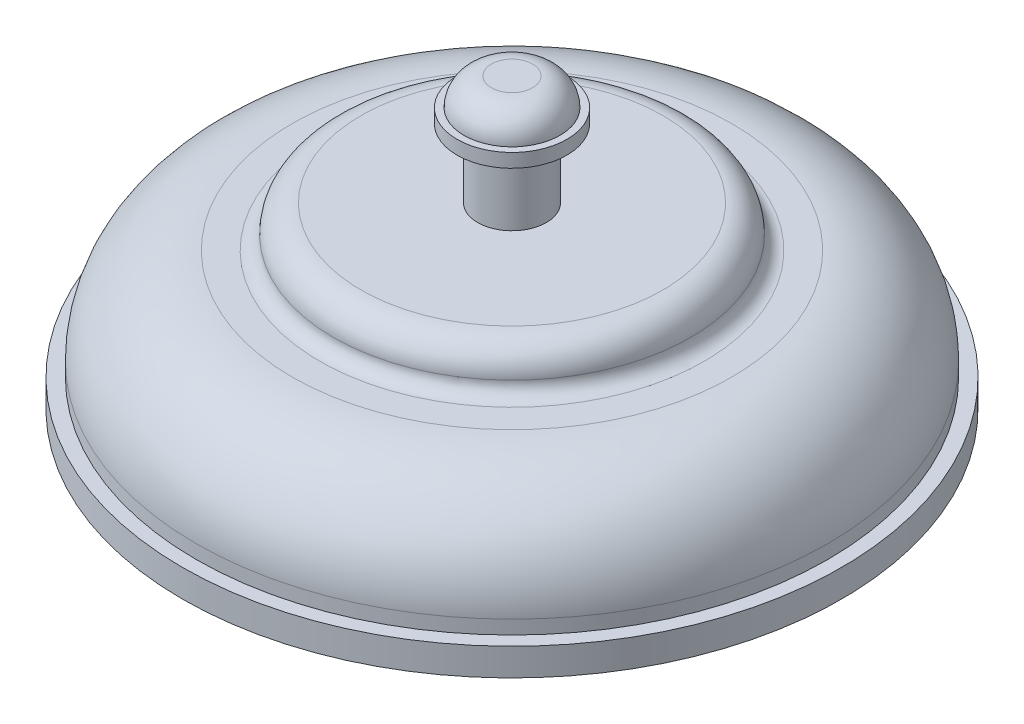
ISO-10303-21;
HEADER;
FILE_DESCRIPTION(('STEP AP214'),'2;1');
FILE_NAME('part.step','',(''),(''),'','','');
FILE_SCHEMA(('AUTOMOTIVE_DESIGN { 1 0 10303 214 1 1 1 1 }'));
ENDSEC;
DATA;
#1=APPLICATION_CONTEXT('core data for automotive mechanical design processes');
#2=APPLICATION_PROTOCOL_DEFINITION('international standard','automotive_design',2000,#1);
#3=PRODUCT_CONTEXT('',#1,'mechanical');
#4=PRODUCT('Part','Part','',(#3));
#5=PRODUCT_RELATED_PRODUCT_CATEGORY('part','',(#4));
#6=PRODUCT_DEFINITION_FORMATION('','',#4);
#7=PRODUCT_DEFINITION_CONTEXT('part definition',#1,'design');
#8=PRODUCT_DEFINITION('design','',#6,#7);
#9=PRODUCT_DEFINITION_SHAPE('','',#8);
#10=(LENGTH_UNIT() NAMED_UNIT(*) SI_UNIT(.MILLI.,.METRE.));
#11=(NAMED_UNIT(*) PLANE_ANGLE_UNIT() SI_UNIT($,.RADIAN.));
#12=(NAMED_UNIT(*) SI_UNIT($,.STERADIAN.) SOLID_ANGLE_UNIT());
#13=UNCERTAINTY_MEASURE_WITH_UNIT(LENGTH_MEASURE(1.E-05),#10,'distance_accuracy_value','');
#14=(GEOMETRIC_REPRESENTATION_CONTEXT(3) GLOBAL_UNCERTAINTY_ASSIGNED_CONTEXT((#13)) GLOBAL_UNIT_ASSIGNED_CONTEXT((#10,
#11,#12)) REPRESENTATION_CONTEXT('',''));
#15=CARTESIAN_POINT('',(0.,0.,0.));
#16=DIRECTION('',(0.,0.,1.));
#17=DIRECTION('',(1.,0.,0.));
#18=AXIS2_PLACEMENT_3D('',#15,#16,#17);
#19=CARTESIAN_POINT('',(0.,6.,0.));
#20=DIRECTION('',(0.,1.,0.));
#21=DIRECTION('',(0.,0.,1.));
#22=AXIS2_PLACEMENT_3D('',#19,#20,#21);
#23=PLANE('',#22);
#24=CARTESIAN_POINT('',(0.,6.,0.));
#25=DIRECTION('',(0.,1.,0.));
#26=DIRECTION('',(0.,0.,1.));
#27=AXIS2_PLACEMENT_3D('',#24,#25,#26);
#28=CIRCLE('',#27,4.);
#29=CARTESIAN_POINT('',(0.,6.,4.));
#30=VERTEX_POINT('',#29);
#31=EDGE_CURVE('P0_E31',#30,#30,#28,.T.);
#32=ORIENTED_EDGE('',*,*,#31,.T.);
#33=EDGE_LOOP('',(#32));
#34=FACE_BOUND('',#33,.T.);
#35=CARTESIAN_POINT('',(0.,6.,0.));
#36=DIRECTION('',(0.,1.,0.));
#37=DIRECTION('',(0.,0.,1.));
#38=AXIS2_PLACEMENT_3D('',#35,#36,#37);
#39=CIRCLE('',#38,3.5);
#40=CARTESIAN_POINT('',(0.,6.,3.5));
#41=VERTEX_POINT('',#40);
#42=EDGE_CURVE('P0_E36',#41,#41,#39,.T.);
#43=ORIENTED_EDGE('',*,*,#42,.F.);
#44=EDGE_LOOP('',(#43));
#45=FACE_BOUND('',#44,.T.);
#46=ADVANCED_FACE('P0_F15',(#34,#45),#23,.T.);
#47=CARTESIAN_POINT('',(0.,5.,0.));
#48=DIRECTION('',(0.,-1.,0.));
#49=DIRECTION('',(0.,0.,-1.));
#50=AXIS2_PLACEMENT_3D('',#47,#48,#49);
#51=CYLINDRICAL_SURFACE('',#50,2.5);
#52=CARTESIAN_POINT('',(0.,5.,0.));
#53=DIRECTION('',(0.,1.,0.));
#54=DIRECTION('',(0.,0.,1.));
#55=AXIS2_PLACEMENT_3D('',#52,#53,#54);
#56=CIRCLE('',#55,2.5);
#57=CARTESIAN_POINT('',(0.,5.,2.5));
#58=VERTEX_POINT('',#57);
#59=EDGE_CURVE('P0_E22',#58,#58,#56,.T.);
#60=ORIENTED_EDGE('',*,*,#59,.F.);
#61=EDGE_LOOP('',(#60));
#62=FACE_BOUND('',#61,.T.);
#63=CARTESIAN_POINT('',(0.,0.,0.));
#64=DIRECTION('',(0.,1.,0.));
#65=DIRECTION('',(0.,0.,1.));
#66=AXIS2_PLACEMENT_3D('',#63,#64,#65);
#67=CIRCLE('',#66,2.5);
#68=CARTESIAN_POINT('',(0.,0.,2.5));
#69=VERTEX_POINT('',#68);
#70=EDGE_CURVE('P0_E26',#69,#69,#67,.T.);
#71=ORIENTED_EDGE('',*,*,#70,.T.);
#72=EDGE_LOOP('',(#71));
#73=FACE_BOUND('',#72,.T.);
#74=ADVANCED_FACE('P0_F45',(#62,#73),#51,.T.);
#75=CARTESIAN_POINT('',(0.,0.,0.));
#76=DIRECTION('',(0.,1.,0.));
#77=DIRECTION('',(0.,0.,1.));
#78=AXIS2_PLACEMENT_3D('',#75,#76,#77);
#79=PLANE('',#78);
#80=ORIENTED_EDGE('',*,*,#70,.F.);
#81=EDGE_LOOP('',(#80));
#82=FACE_BOUND('',#81,.T.);
#83=ADVANCED_FACE('P0_F53',(#82),#79,.F.);
#84=CARTESIAN_POINT('',(0.,5.,0.));
#85=DIRECTION('',(0.,1.,0.));
#86=DIRECTION('',(0.,0.,1.));
#87=AXIS2_PLACEMENT_3D('',#84,#85,#86);
#88=PLANE('',#87);
#89=CARTESIAN_POINT('',(0.,5.,0.));
#90=DIRECTION('',(0.,1.,0.));
#91=DIRECTION('',(0.,0.,1.));
#92=AXIS2_PLACEMENT_3D('',#89,#90,#91);
#93=CIRCLE('',#92,4.);
#94=CARTESIAN_POINT('',(0.,5.,4.));
#95=VERTEX_POINT('',#94);
#96=EDGE_CURVE('P0_E33',#95,#95,#93,.T.);
#97=ORIENTED_EDGE('',*,*,#96,.F.);
#98=EDGE_LOOP('',(#97));
#99=FACE_BOUND('',#98,.T.);
#100=ORIENTED_EDGE('',*,*,#59,.T.);
#101=EDGE_LOOP('',(#100));
#102=FACE_BOUND('',#101,.T.);
#103=ADVANCED_FACE('P0_F58',(#99,#102),#88,.F.);
#104=CARTESIAN_POINT('',(0.,6.,0.));
#105=DIRECTION('',(0.,-1.,0.));
#106=DIRECTION('',(0.,0.,-1.));
#107=AXIS2_PLACEMENT_3D('',#104,#105,#106);
#108=CYLINDRICAL_SURFACE('',#107,4.);
#109=ORIENTED_EDGE('',*,*,#31,.F.);
#110=EDGE_LOOP('',(#109));
#111=FACE_BOUND('',#110,.T.);
#112=ORIENTED_EDGE('',*,*,#96,.T.);
#113=EDGE_LOOP('',(#112));
#114=FACE_BOUND('',#113,.T.);
#115=ADVANCED_FACE('P0_F61',(#111,#114),#108,.T.);
#116=CARTESIAN_POINT('',(0.,8.,0.));
#117=DIRECTION('',(0.,1.,0.));
#118=DIRECTION('',(0.,0.,1.));
#119=AXIS2_PLACEMENT_3D('',#116,#117,#118);
#120=PLANE('',#119);
#121=CARTESIAN_POINT('',(0.,8.,0.));
#122=DIRECTION('',(0.,1.,0.));
#123=DIRECTION('',(0.,0.,1.));
#124=AXIS2_PLACEMENT_3D('',#121,#122,#123);
#125=CIRCLE('',#124,1.5);
#126=CARTESIAN_POINT('',(0.,8.,1.5));
#127=VERTEX_POINT('',#126);
#128=EDGE_CURVE('P0_E10',#127,#127,#125,.T.);
#129=ORIENTED_EDGE('',*,*,#128,.T.);
#130=EDGE_LOOP('',(#129));
#131=FACE_BOUND('',#130,.T.);
#132=ADVANCED_FACE('P0_F57',(#131),#120,.T.);
#133=CARTESIAN_POINT('',(0.,6.,0.));
#134=DIRECTION('',(0.,1.,0.));
#135=DIRECTION('',(0.,0.,1.));
#136=AXIS2_PLACEMENT_3D('',#133,#134,#135);
#137=DEGENERATE_TOROIDAL_SURFACE('',#136,1.5,2.,.T.);
#138=ORIENTED_EDGE('',*,*,#42,.T.);
#139=EDGE_LOOP('',(#138));
#140=FACE_BOUND('',#139,.T.);
#141=ORIENTED_EDGE('',*,*,#128,.F.);
#142=EDGE_LOOP('',(#141));
#143=FACE_BOUND('',#142,.T.);
#144=ADVANCED_FACE('P0_F17',(#140,#143),#137,.T.);
#145=CLOSED_SHELL('',(#46,#74,#83,#103,#115,#132,#144));
#146=MANIFOLD_SOLID_BREP('P0_B1',#145);
#147=CARTESIAN_POINT('',(0.,0.,0.));
#148=DIRECTION('',(0.,-1.,0.));
#149=DIRECTION('',(0.,0.,-1.));
#150=AXIS2_PLACEMENT_3D('',#147,#148,#149);
#151=PLANE('',#150);
#152=CARTESIAN_POINT('',(0.,0.,0.));
#153=DIRECTION('',(0.,-1.,0.));
#154=DIRECTION('',(0.,0.,-1.));
#155=AXIS2_PLACEMENT_3D('',#152,#153,#154);
#156=CIRCLE('',#155,11.);
#157=CARTESIAN_POINT('',(0.,0.,-11.));
#158=VERTEX_POINT('',#157);
#159=EDGE_CURVE('P1_E35',#158,#158,#156,.F.);
#160=ORIENTED_EDGE('',*,*,#159,.T.);
#161=EDGE_LOOP('',(#160));
#162=FACE_BOUND('',#161,.T.);
#163=ADVANCED_FACE('P1_F15',(#162),#151,.F.);
#164=CARTESIAN_POINT('',(0.,-3.,0.));
#165=DIRECTION('',(0.,-1.,0.));
#166=DIRECTION('',(0.,0.,-1.));
#167=AXIS2_PLACEMENT_3D('',#164,#165,#166);
#168=PLANE('',#167);
#169=CARTESIAN_POINT('',(0.,-3.,0.));
#170=DIRECTION('',(0.,-1.,0.));
#171=DIRECTION('',(0.,0.,-1.));
#172=AXIS2_PLACEMENT_3D('',#169,#170,#171);
#173=CIRCLE('',#172,16.);
#174=CARTESIAN_POINT('',(0.,-3.,-16.));
#175=VERTEX_POINT('',#174);
#176=EDGE_CURVE('P1_E22',#175,#175,#173,.F.);
#177=ORIENTED_EDGE('',*,*,#176,.T.);
#178=EDGE_LOOP('',(#177));
#179=FACE_BOUND('',#178,.T.);
#180=CARTESIAN_POINT('',(0.,-3.,0.));
#181=DIRECTION('',(0.,-1.,0.));
#182=DIRECTION('',(0.,0.,-1.));
#183=AXIS2_PLACEMENT_3D('',#180,#181,#182);
#184=CIRCLE('',#183,14.);
#185=CARTESIAN_POINT('',(0.,-3.,-14.));
#186=VERTEX_POINT('',#185);
#187=EDGE_CURVE('P1_E30',#186,#186,#184,.T.);
#188=ORIENTED_EDGE('',*,*,#187,.T.);
#189=EDGE_LOOP('',(#188));
#190=FACE_BOUND('',#189,.T.);
#191=ADVANCED_FACE('P1_F89',(#179,#190),#168,.F.);
#192=CARTESIAN_POINT('',(0.,-11.,0.));
#193=DIRECTION('',(0.,1.,0.));
#194=DIRECTION('',(0.,0.,1.));
#195=AXIS2_PLACEMENT_3D('',#192,#193,#194);
#196=CYLINDRICAL_SURFACE('',#195,23.);
#197=CARTESIAN_POINT('',(0.,-10.,0.));
#198=DIRECTION('',(0.,-1.,0.));
#199=DIRECTION('',(0.,0.,-1.));
#200=AXIS2_PLACEMENT_3D('',#197,#198,#199);
#201=CIRCLE('',#200,23.);
#202=CARTESIAN_POINT('',(0.,-10.,-23.));
#203=VERTEX_POINT('',#202);
#204=EDGE_CURVE('P1_E26',#203,#203,#201,.T.);
#205=ORIENTED_EDGE('',*,*,#204,.T.);
#206=EDGE_LOOP('',(#205));
#207=FACE_BOUND('',#206,.T.);
#208=CARTESIAN_POINT('',(0.,-11.,0.));
#209=DIRECTION('',(0.,-1.,0.));
#210=DIRECTION('',(0.,0.,-1.));
#211=AXIS2_PLACEMENT_3D('',#208,#209,#210);
#212=CIRCLE('',#211,23.);
#213=CARTESIAN_POINT('',(0.,-11.,-23.));
#214=VERTEX_POINT('',#213);
#215=EDGE_CURVE('P1_E41',#214,#214,#212,.T.);
#216=ORIENTED_EDGE('',*,*,#215,.F.);
#217=EDGE_LOOP('',(#216));
#218=FACE_BOUND('',#217,.T.);
#219=ADVANCED_FACE('P1_F96',(#207,#218),#196,.T.);
#220=CARTESIAN_POINT('',(0.,-2.,0.));
#221=DIRECTION('',(0.,-1.,0.));
#222=DIRECTION('',(0.,0.,-1.));
#223=AXIS2_PLACEMENT_3D('',#220,#221,#222);
#224=TOROIDAL_SURFACE('',#223,11.,2.);
#225=ORIENTED_EDGE('',*,*,#159,.F.);
#226=EDGE_LOOP('',(#225));
#227=FACE_BOUND('',#226,.T.);
#228=CARTESIAN_POINT('',(0.,-2.,0.));
#229=DIRECTION('',(0.,-1.,0.));
#230=DIRECTION('',(0.,0.,-1.));
#231=AXIS2_PLACEMENT_3D('',#228,#229,#230);
#232=CIRCLE('',#231,13.);
#233=CARTESIAN_POINT('',(0.,-2.,-13.));
#234=VERTEX_POINT('',#233);
#235=EDGE_CURVE('P1_E38',#234,#234,#232,.T.);
#236=ORIENTED_EDGE('',*,*,#235,.F.);
#237=EDGE_LOOP('',(#236));
#238=FACE_BOUND('',#237,.T.);
#239=ADVANCED_FACE('P1_F100',(#227,#238),#224,.T.);
#240=CARTESIAN_POINT('',(0.,-2.,0.));
#241=DIRECTION('',(0.,-1.,0.));
#242=DIRECTION('',(0.,0.,-1.));
#243=AXIS2_PLACEMENT_3D('',#240,#241,#242);
#244=TOROIDAL_SURFACE('',#243,14.,1.);
#245=ORIENTED_EDGE('',*,*,#235,.T.);
#246=EDGE_LOOP('',(#245));
#247=FACE_BOUND('',#246,.T.);
#248=ORIENTED_EDGE('',*,*,#187,.F.);
#249=EDGE_LOOP('',(#248));
#250=FACE_BOUND('',#249,.T.);
#251=ADVANCED_FACE('P1_F102',(#247,#250),#244,.F.);
#252=CARTESIAN_POINT('',(0.,-10.,0.));
#253=DIRECTION('',(0.,-1.,0.));
#254=DIRECTION('',(0.,0.,-1.));
#255=AXIS2_PLACEMENT_3D('',#252,#253,#254);
#256=TOROIDAL_SURFACE('',#255,16.,7.);
#257=ORIENTED_EDGE('',*,*,#176,.F.);
#258=EDGE_LOOP('',(#257));
#259=FACE_BOUND('',#258,.T.);
#260=ORIENTED_EDGE('',*,*,#204,.F.);
#261=EDGE_LOOP('',(#260));
#262=FACE_BOUND('',#261,.T.);
#263=ADVANCED_FACE('P1_F17',(#259,#262),#256,.T.);
#264=CARTESIAN_POINT('',(0.,-11.,0.));
#265=DIRECTION('',(0.,-1.,0.));
#266=DIRECTION('',(0.,0.,-1.));
#267=AXIS2_PLACEMENT_3D('',#264,#265,#266);
#268=PLANE('',#267);
#269=CARTESIAN_POINT('',(0.,-11.,0.));
#270=DIRECTION('',(0.,-1.,0.));
#271=DIRECTION('',(0.,0.,-1.));
#272=AXIS2_PLACEMENT_3D('',#269,#270,#271);
#273=CIRCLE('',#272,24.);
#274=CARTESIAN_POINT('',(0.,-11.,-24.));
#275=VERTEX_POINT('',#274);
#276=EDGE_CURVE('P1_E60',#275,#275,#273,.T.);
#277=ORIENTED_EDGE('',*,*,#276,.F.);
#278=EDGE_LOOP('',(#277));
#279=FACE_BOUND('',#278,.T.);
#280=ORIENTED_EDGE('',*,*,#215,.T.);
#281=EDGE_LOOP('',(#280));
#282=FACE_BOUND('',#281,.T.);
#283=ADVANCED_FACE('P1_F74',(#279,#282),#268,.F.);
#284=CARTESIAN_POINT('',(0.,-13.,0.));
#285=DIRECTION('',(0.,-1.,0.));
#286=DIRECTION('',(0.,0.,-1.));
#287=AXIS2_PLACEMENT_3D('',#284,#285,#286);
#288=PLANE('',#287);
#289=CARTESIAN_POINT('',(0.,-13.,0.));
#290=DIRECTION('',(0.,-1.,0.));
#291=DIRECTION('',(0.,0.,-1.));
#292=AXIS2_PLACEMENT_3D('',#289,#290,#291);
#293=CIRCLE('',#292,24.);
#294=CARTESIAN_POINT('',(0.,-13.,-24.));
#295=VERTEX_POINT('',#294);
#296=EDGE_CURVE('P1_E49',#295,#295,#293,.T.);
#297=ORIENTED_EDGE('',*,*,#296,.T.);
#298=EDGE_LOOP('',(#297));
#299=FACE_BOUND('',#298,.T.);
#300=CARTESIAN_POINT('',(0.,-13.,0.));
#301=DIRECTION('',(0.,-1.,0.));
#302=DIRECTION('',(0.,0.,-1.));
#303=AXIS2_PLACEMENT_3D('',#300,#301,#302);
#304=CIRCLE('',#303,22.);
#305=CARTESIAN_POINT('',(0.,-13.,-22.));
#306=VERTEX_POINT('',#305);
#307=EDGE_CURVE('P1_E63',#306,#306,#304,.T.);
#308=ORIENTED_EDGE('',*,*,#307,.F.);
#309=EDGE_LOOP('',(#308));
#310=FACE_BOUND('',#309,.T.);
#311=ADVANCED_FACE('P1_F71',(#299,#310),#288,.T.);
#312=CARTESIAN_POINT('',(0.,-13.,0.));
#313=DIRECTION('',(0.,1.,0.));
#314=DIRECTION('',(0.,0.,1.));
#315=AXIS2_PLACEMENT_3D('',#312,#313,#314);
#316=CYLINDRICAL_SURFACE('',#315,24.);
#317=ORIENTED_EDGE('',*,*,#296,.F.);
#318=EDGE_LOOP('',(#317));
#319=FACE_BOUND('',#318,.T.);
#320=ORIENTED_EDGE('',*,*,#276,.T.);
#321=EDGE_LOOP('',(#320));
#322=FACE_BOUND('',#321,.T.);
#323=ADVANCED_FACE('P1_F73',(#319,#322),#316,.T.);
#324=CARTESIAN_POINT('',(0.,-13.,0.));
#325=DIRECTION('',(0.,1.,0.));
#326=DIRECTION('',(0.,0.,1.));
#327=AXIS2_PLACEMENT_3D('',#324,#325,#326);
#328=CYLINDRICAL_SURFACE('',#327,22.);
#329=ORIENTED_EDGE('',*,*,#307,.T.);
#330=EDGE_LOOP('',(#329));
#331=FACE_BOUND('',#330,.T.);
#332=CARTESIAN_POINT('',(0.,-11.,0.));
#333=DIRECTION('',(0.,-1.,0.));
#334=DIRECTION('',(0.,0.,-1.));
#335=AXIS2_PLACEMENT_3D('',#332,#333,#334);
#336=CIRCLE('',#335,22.);
#337=CARTESIAN_POINT('',(0.,-11.,-22.));
#338=VERTEX_POINT('',#337);
#339=EDGE_CURVE('P1_E10',#338,#338,#336,.F.);
#340=ORIENTED_EDGE('',*,*,#339,.T.);
#341=EDGE_LOOP('',(#340));
#342=FACE_BOUND('',#341,.T.);
#343=ADVANCED_FACE('P1_F69',(#331,#342),#328,.F.);
#344=CARTESIAN_POINT('',(0.,-2.,0.));
#345=DIRECTION('',(0.,-1.,0.));
#346=DIRECTION('',(0.,0.,-1.));
#347=AXIS2_PLACEMENT_3D('',#344,#345,#346);
#348=PLANE('',#347);
#349=CARTESIAN_POINT('',(0.,-2.,0.));
#350=DIRECTION('',(0.,1.,0.));
#351=DIRECTION('',(0.,0.,1.));
#352=AXIS2_PLACEMENT_3D('',#349,#350,#351);
#353=CIRCLE('',#352,11.);
#354=CARTESIAN_POINT('',(0.,-2.,11.));
#355=VERTEX_POINT('',#354);
#356=EDGE_CURVE('P1_E48',#355,#355,#353,.F.);
#357=ORIENTED_EDGE('',*,*,#356,.T.);
#358=EDGE_LOOP('',(#357));
#359=FACE_BOUND('',#358,.T.);
#360=ADVANCED_FACE('P1_F161',(#359),#348,.T.);
#361=CARTESIAN_POINT('',(0.,-2.,0.));
#362=DIRECTION('',(0.,-1.,0.));
#363=DIRECTION('',(0.,0.,-1.));
#364=AXIS2_PLACEMENT_3D('',#361,#362,#363);
#365=TOROIDAL_SURFACE('',#364,14.,3.);
#366=ORIENTED_EDGE('',*,*,#356,.F.);
#367=EDGE_LOOP('',(#366));
#368=FACE_BOUND('',#367,.T.);
#369=CARTESIAN_POINT('',(0.,-5.,0.));
#370=DIRECTION('',(0.,-1.,0.));
#371=DIRECTION('',(0.,0.,-1.));
#372=AXIS2_PLACEMENT_3D('',#369,#370,#371);
#373=CIRCLE('',#372,14.);
#374=CARTESIAN_POINT('',(0.,-5.,-14.));
#375=VERTEX_POINT('',#374);
#376=EDGE_CURVE('P1_E53',#375,#375,#373,.T.);
#377=ORIENTED_EDGE('',*,*,#376,.T.);
#378=EDGE_LOOP('',(#377));
#379=FACE_BOUND('',#378,.T.);
#380=ADVANCED_FACE('P1_F168',(#368,#379),#365,.T.);
#381=CARTESIAN_POINT('',(0.,-5.,0.));
#382=DIRECTION('',(0.,-1.,0.));
#383=DIRECTION('',(0.,0.,-1.));
#384=AXIS2_PLACEMENT_3D('',#381,#382,#383);
#385=PLANE('',#384);
#386=CARTESIAN_POINT('',(0.,-5.,0.));
#387=DIRECTION('',(0.,-1.,0.));
#388=DIRECTION('',(0.,0.,-1.));
#389=AXIS2_PLACEMENT_3D('',#386,#387,#388);
#390=CIRCLE('',#389,16.);
#391=CARTESIAN_POINT('',(0.,-5.,-16.));
#392=VERTEX_POINT('',#391);
#393=EDGE_CURVE('P1_E44',#392,#392,#390,.F.);
#394=ORIENTED_EDGE('',*,*,#393,.F.);
#395=EDGE_LOOP('',(#394));
#396=FACE_BOUND('',#395,.T.);
#397=ORIENTED_EDGE('',*,*,#376,.F.);
#398=EDGE_LOOP('',(#397));
#399=FACE_BOUND('',#398,.T.);
#400=ADVANCED_FACE('P1_F177',(#396,#399),#385,.T.);
#401=CARTESIAN_POINT('',(0.,-10.,0.));
#402=DIRECTION('',(0.,-1.,0.));
#403=DIRECTION('',(0.,0.,-1.));
#404=AXIS2_PLACEMENT_3D('',#401,#402,#403);
#405=TOROIDAL_SURFACE('',#404,16.,5.);
#406=ORIENTED_EDGE('',*,*,#393,.T.);
#407=EDGE_LOOP('',(#406));
#408=FACE_BOUND('',#407,.T.);
#409=CARTESIAN_POINT('',(0.,-10.,0.));
#410=DIRECTION('',(0.,1.,0.));
#411=DIRECTION('',(0.,0.,1.));
#412=AXIS2_PLACEMENT_3D('',#409,#410,#411);
#413=CIRCLE('',#412,21.);
#414=CARTESIAN_POINT('',(0.,-10.,21.));
#415=VERTEX_POINT('',#414);
#416=EDGE_CURVE('P1_E50',#415,#415,#413,.F.);
#417=ORIENTED_EDGE('',*,*,#416,.T.);
#418=EDGE_LOOP('',(#417));
#419=FACE_BOUND('',#418,.T.);
#420=ADVANCED_FACE('P1_F185',(#408,#419),#405,.F.);
#421=CARTESIAN_POINT('',(0.,-11.,0.));
#422=DIRECTION('',(0.,1.,0.));
#423=DIRECTION('',(0.,0.,1.));
#424=AXIS2_PLACEMENT_3D('',#421,#422,#423);
#425=CYLINDRICAL_SURFACE('',#424,21.);
#426=ORIENTED_EDGE('',*,*,#416,.F.);
#427=EDGE_LOOP('',(#426));
#428=FACE_BOUND('',#427,.T.);
#429=CARTESIAN_POINT('',(0.,-11.,0.));
#430=DIRECTION('',(0.,-1.,0.));
#431=DIRECTION('',(0.,0.,-1.));
#432=AXIS2_PLACEMENT_3D('',#429,#430,#431);
#433=CIRCLE('',#432,21.);
#434=CARTESIAN_POINT('',(0.,-11.,-21.));
#435=VERTEX_POINT('',#434);
#436=EDGE_CURVE('P1_E45',#435,#435,#433,.T.);
#437=ORIENTED_EDGE('',*,*,#436,.T.);
#438=EDGE_LOOP('',(#437));
#439=FACE_BOUND('',#438,.T.);
#440=ADVANCED_FACE('P1_F192',(#428,#439),#425,.F.);
#441=CARTESIAN_POINT('',(0.,-11.,0.));
#442=DIRECTION('',(0.,-1.,0.));
#443=DIRECTION('',(0.,0.,-1.));
#444=AXIS2_PLACEMENT_3D('',#441,#442,#443);
#445=PLANE('',#444);
#446=ORIENTED_EDGE('',*,*,#339,.F.);
#447=EDGE_LOOP('',(#446));
#448=FACE_BOUND('',#447,.T.);
#449=ORIENTED_EDGE('',*,*,#436,.F.);
#450=EDGE_LOOP('',(#449));
#451=FACE_BOUND('',#450,.T.);
#452=ADVANCED_FACE('P1_F199',(#448,#451),#445,.T.);
#453=CLOSED_SHELL('',(#163,#191,#219,#239,#251,#263,#283,#311,#323,#343,#360,#380,#400,#420,
#440,#452));
#454=MANIFOLD_SOLID_BREP('P1_B1',#453);
#455=ADVANCED_BREP_SHAPE_REPRESENTATION('',(#18,#146,#454),#14);
#456=SHAPE_DEFINITION_REPRESENTATION(#9,#455);
ENDSEC;
END-ISO-10303-21;
